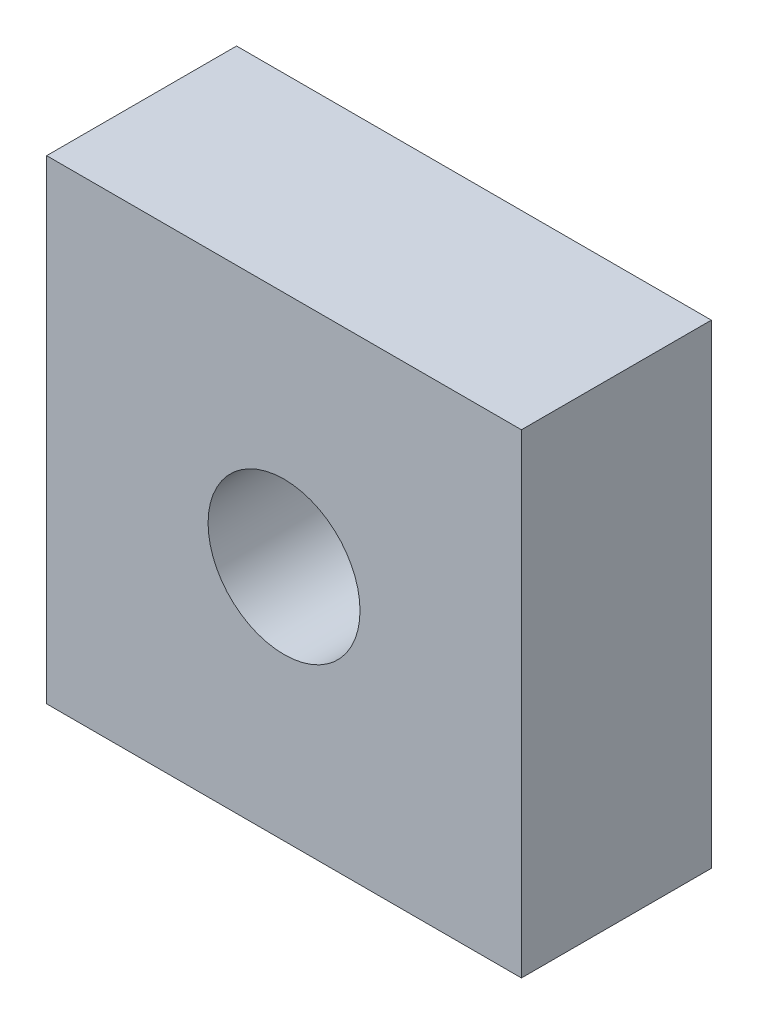
ISO-10303-21;
HEADER;
FILE_DESCRIPTION(('STEP AP214'),'2;1');
FILE_NAME('part.step','',(''),(''),'','','');
FILE_SCHEMA(('AUTOMOTIVE_DESIGN { 1 0 10303 214 1 1 1 1 }'));
ENDSEC;
DATA;
#1=APPLICATION_CONTEXT('core data for automotive mechanical design processes');
#2=APPLICATION_PROTOCOL_DEFINITION('international standard','automotive_design',2000,#1);
#3=PRODUCT_CONTEXT('',#1,'mechanical');
#4=PRODUCT('Part','Part','',(#3));
#5=PRODUCT_RELATED_PRODUCT_CATEGORY('part','',(#4));
#6=PRODUCT_DEFINITION_FORMATION('','',#4);
#7=PRODUCT_DEFINITION_CONTEXT('part definition',#1,'design');
#8=PRODUCT_DEFINITION('design','',#6,#7);
#9=PRODUCT_DEFINITION_SHAPE('','',#8);
#10=(LENGTH_UNIT() NAMED_UNIT(*) SI_UNIT(.MILLI.,.METRE.));
#11=(NAMED_UNIT(*) PLANE_ANGLE_UNIT() SI_UNIT($,.RADIAN.));
#12=(NAMED_UNIT(*) SI_UNIT($,.STERADIAN.) SOLID_ANGLE_UNIT());
#13=UNCERTAINTY_MEASURE_WITH_UNIT(LENGTH_MEASURE(1.E-05),#10,'distance_accuracy_value','');
#14=(GEOMETRIC_REPRESENTATION_CONTEXT(3) GLOBAL_UNCERTAINTY_ASSIGNED_CONTEXT((#13)) GLOBAL_UNIT_ASSIGNED_CONTEXT((#10,
#11,#12)) REPRESENTATION_CONTEXT('',''));
#15=CARTESIAN_POINT('',(0.,0.,0.));
#16=DIRECTION('',(0.,0.,1.));
#17=DIRECTION('',(1.,0.,0.));
#18=AXIS2_PLACEMENT_3D('',#15,#16,#17);
#19=CARTESIAN_POINT('',(0.,0.,4.));
#20=DIRECTION('',(0.,0.,-1.));
#21=DIRECTION('',(-1.,0.,0.));
#22=AXIS2_PLACEMENT_3D('',#19,#20,#21);
#23=PLANE('',#22);
#24=DIRECTION('',(0.,-1.,0.));
#25=VECTOR('',#24,1.);
#26=CARTESIAN_POINT('',(0.,0.,4.));
#27=LINE('',#26,#25);
#28=CARTESIAN_POINT('',(0.,10.,4.));
#29=VERTEX_POINT('',#28);
#30=CARTESIAN_POINT('',(0.,0.,4.));
#31=VERTEX_POINT('',#30);
#32=EDGE_CURVE('E104',#29,#31,#27,.T.);
#33=ORIENTED_EDGE('',*,*,#32,.T.);
#34=DIRECTION('',(1.,0.,0.));
#35=VECTOR('',#34,1.);
#36=CARTESIAN_POINT('',(0.,0.,4.));
#37=LINE('',#36,#35);
#38=CARTESIAN_POINT('',(10.,0.,4.));
#39=VERTEX_POINT('',#38);
#40=EDGE_CURVE('E99',#31,#39,#37,.T.);
#41=ORIENTED_EDGE('',*,*,#40,.T.);
#42=DIRECTION('',(0.,1.,0.));
#43=VECTOR('',#42,1.);
#44=CARTESIAN_POINT('',(10.,0.,4.));
#45=LINE('',#44,#43);
#46=CARTESIAN_POINT('',(10.,10.,4.));
#47=VERTEX_POINT('',#46);
#48=EDGE_CURVE('E102',#39,#47,#45,.T.);
#49=ORIENTED_EDGE('',*,*,#48,.T.);
#50=DIRECTION('',(-1.,0.,0.));
#51=VECTOR('',#50,1.);
#52=CARTESIAN_POINT('',(0.,10.,4.));
#53=LINE('',#52,#51);
#54=EDGE_CURVE('E69',#47,#29,#53,.T.);
#55=ORIENTED_EDGE('',*,*,#54,.T.);
#56=EDGE_LOOP('',(#33,#41,#49,#55));
#57=FACE_BOUND('',#56,.T.);
#58=CARTESIAN_POINT('',(5.,5.,4.));
#59=DIRECTION('',(0.,0.,1.));
#60=DIRECTION('',(1.,0.,0.));
#61=AXIS2_PLACEMENT_3D('',#58,#59,#60);
#62=CIRCLE('',#61,1.6);
#63=CARTESIAN_POINT('',(6.6,5.,4.));
#64=VERTEX_POINT('',#63);
#65=EDGE_CURVE('E124',#64,#64,#62,.T.);
#66=ORIENTED_EDGE('',*,*,#65,.F.);
#67=EDGE_LOOP('',(#66));
#68=FACE_BOUND('',#67,.T.);
#69=ADVANCED_FACE('F51',(#57,#68),#23,.F.);
#70=CARTESIAN_POINT('',(0.,0.,0.));
#71=DIRECTION('',(0.,0.,-1.));
#72=DIRECTION('',(-1.,0.,0.));
#73=AXIS2_PLACEMENT_3D('',#70,#71,#72);
#74=PLANE('',#73);
#75=DIRECTION('',(0.,-1.,0.));
#76=VECTOR('',#75,1.);
#77=CARTESIAN_POINT('',(0.,0.,0.));
#78=LINE('',#77,#76);
#79=CARTESIAN_POINT('',(0.,10.,0.));
#80=VERTEX_POINT('',#79);
#81=CARTESIAN_POINT('',(0.,0.,0.));
#82=VERTEX_POINT('',#81);
#83=EDGE_CURVE('E120',#80,#82,#78,.T.);
#84=ORIENTED_EDGE('',*,*,#83,.F.);
#85=DIRECTION('',(-1.,0.,0.));
#86=VECTOR('',#85,1.);
#87=CARTESIAN_POINT('',(0.,10.,0.));
#88=LINE('',#87,#86);
#89=CARTESIAN_POINT('',(10.,10.,0.));
#90=VERTEX_POINT('',#89);
#91=EDGE_CURVE('E92',#90,#80,#88,.T.);
#92=ORIENTED_EDGE('',*,*,#91,.F.);
#93=DIRECTION('',(0.,1.,0.));
#94=VECTOR('',#93,1.);
#95=CARTESIAN_POINT('',(10.,0.,0.));
#96=LINE('',#95,#94);
#97=CARTESIAN_POINT('',(10.,0.,0.));
#98=VERTEX_POINT('',#97);
#99=EDGE_CURVE('E86',#98,#90,#96,.T.);
#100=ORIENTED_EDGE('',*,*,#99,.F.);
#101=DIRECTION('',(1.,0.,0.));
#102=VECTOR('',#101,1.);
#103=CARTESIAN_POINT('',(0.,0.,0.));
#104=LINE('',#103,#102);
#105=EDGE_CURVE('E109',#82,#98,#104,.T.);
#106=ORIENTED_EDGE('',*,*,#105,.F.);
#107=EDGE_LOOP('',(#84,#92,#100,#106));
#108=FACE_BOUND('',#107,.T.);
#109=CARTESIAN_POINT('',(5.,5.,0.));
#110=DIRECTION('',(0.,0.,1.));
#111=DIRECTION('',(1.,0.,0.));
#112=AXIS2_PLACEMENT_3D('',#109,#110,#111);
#113=CIRCLE('',#112,1.6);
#114=CARTESIAN_POINT('',(6.6,5.,0.));
#115=VERTEX_POINT('',#114);
#116=EDGE_CURVE('E142',#115,#115,#113,.T.);
#117=ORIENTED_EDGE('',*,*,#116,.T.);
#118=EDGE_LOOP('',(#117));
#119=FACE_BOUND('',#118,.T.);
#120=ADVANCED_FACE('F137',(#108,#119),#74,.T.);
#121=CARTESIAN_POINT('',(0.,0.,4.));
#122=DIRECTION('',(1.,0.,0.));
#123=DIRECTION('',(0.,0.,-1.));
#124=AXIS2_PLACEMENT_3D('',#121,#122,#123);
#125=PLANE('',#124);
#126=ORIENTED_EDGE('',*,*,#83,.T.);
#127=DIRECTION('',(0.,0.,-1.));
#128=VECTOR('',#127,1.);
#129=CARTESIAN_POINT('',(0.,0.,4.));
#130=LINE('',#129,#128);
#131=EDGE_CURVE('E11',#31,#82,#130,.T.);
#132=ORIENTED_EDGE('',*,*,#131,.F.);
#133=ORIENTED_EDGE('',*,*,#32,.F.);
#134=DIRECTION('',(0.,0.,-1.));
#135=VECTOR('',#134,1.);
#136=CARTESIAN_POINT('',(0.,10.,4.));
#137=LINE('',#136,#135);
#138=EDGE_CURVE('E116',#29,#80,#137,.T.);
#139=ORIENTED_EDGE('',*,*,#138,.T.);
#140=EDGE_LOOP('',(#126,#132,#133,#139));
#141=FACE_BOUND('',#140,.T.);
#142=ADVANCED_FACE('F53',(#141),#125,.F.);
#143=CARTESIAN_POINT('',(0.,0.,4.));
#144=DIRECTION('',(0.,1.,0.));
#145=DIRECTION('',(0.,0.,1.));
#146=AXIS2_PLACEMENT_3D('',#143,#144,#145);
#147=PLANE('',#146);
#148=ORIENTED_EDGE('',*,*,#105,.T.);
#149=DIRECTION('',(0.,0.,-1.));
#150=VECTOR('',#149,1.);
#151=CARTESIAN_POINT('',(10.,0.,4.));
#152=LINE('',#151,#150);
#153=EDGE_CURVE('E61',#39,#98,#152,.T.);
#154=ORIENTED_EDGE('',*,*,#153,.F.);
#155=ORIENTED_EDGE('',*,*,#40,.F.);
#156=ORIENTED_EDGE('',*,*,#131,.T.);
#157=EDGE_LOOP('',(#148,#154,#155,#156));
#158=FACE_BOUND('',#157,.T.);
#159=ADVANCED_FACE('F108',(#158),#147,.F.);
#160=CARTESIAN_POINT('',(10.,0.,4.));
#161=DIRECTION('',(-1.,0.,0.));
#162=DIRECTION('',(0.,0.,1.));
#163=AXIS2_PLACEMENT_3D('',#160,#161,#162);
#164=PLANE('',#163);
#165=ORIENTED_EDGE('',*,*,#99,.T.);
#166=DIRECTION('',(0.,0.,-1.));
#167=VECTOR('',#166,1.);
#168=CARTESIAN_POINT('',(10.,10.,4.));
#169=LINE('',#168,#167);
#170=EDGE_CURVE('E111',#47,#90,#169,.T.);
#171=ORIENTED_EDGE('',*,*,#170,.F.);
#172=ORIENTED_EDGE('',*,*,#48,.F.);
#173=ORIENTED_EDGE('',*,*,#153,.T.);
#174=EDGE_LOOP('',(#165,#171,#172,#173));
#175=FACE_BOUND('',#174,.T.);
#176=ADVANCED_FACE('F112',(#175),#164,.F.);
#177=CARTESIAN_POINT('',(0.,10.,4.));
#178=DIRECTION('',(0.,-1.,0.));
#179=DIRECTION('',(0.,0.,-1.));
#180=AXIS2_PLACEMENT_3D('',#177,#178,#179);
#181=PLANE('',#180);
#182=ORIENTED_EDGE('',*,*,#91,.T.);
#183=ORIENTED_EDGE('',*,*,#138,.F.);
#184=ORIENTED_EDGE('',*,*,#54,.F.);
#185=ORIENTED_EDGE('',*,*,#170,.T.);
#186=EDGE_LOOP('',(#182,#183,#184,#185));
#187=FACE_BOUND('',#186,.T.);
#188=ADVANCED_FACE('F134',(#187),#181,.F.);
#189=CARTESIAN_POINT('',(5.,5.,4.));
#190=DIRECTION('',(0.,0.,-1.));
#191=DIRECTION('',(-1.,0.,0.));
#192=AXIS2_PLACEMENT_3D('',#189,#190,#191);
#193=CYLINDRICAL_SURFACE('',#192,1.6);
#194=ORIENTED_EDGE('',*,*,#65,.T.);
#195=EDGE_LOOP('',(#194));
#196=FACE_BOUND('',#195,.T.);
#197=ORIENTED_EDGE('',*,*,#116,.F.);
#198=EDGE_LOOP('',(#197));
#199=FACE_BOUND('',#198,.T.);
#200=ADVANCED_FACE('F150',(#196,#199),#193,.F.);
#201=CLOSED_SHELL('',(#69,#120,#142,#159,#176,#188,#200));
#202=MANIFOLD_SOLID_BREP('B2',#201);
#203=ADVANCED_BREP_SHAPE_REPRESENTATION('',(#18,#202),#14);
#204=SHAPE_DEFINITION_REPRESENTATION(#9,#203);
ENDSEC;
END-ISO-10303-21;
